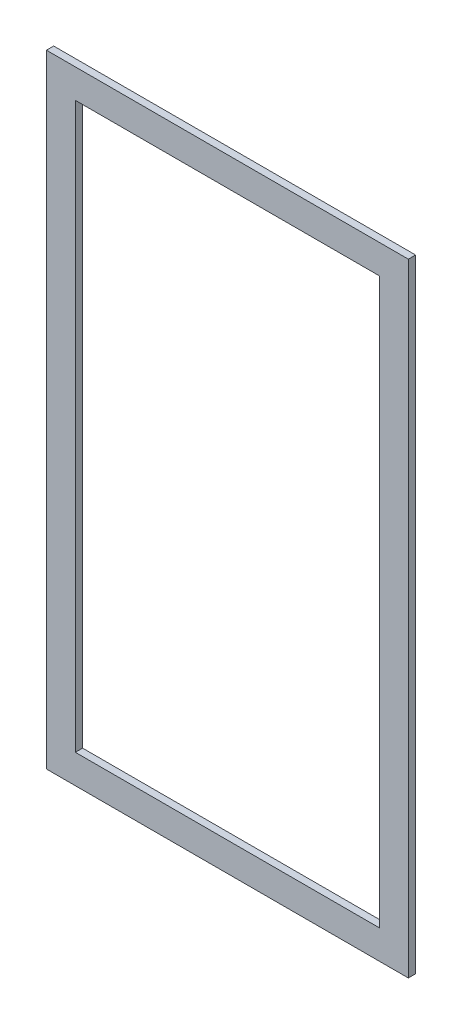
ISO-10303-21;
HEADER;
FILE_DESCRIPTION(('STEP AP214'),'2;1');
FILE_NAME('part.step','',(''),(''),'','','');
FILE_SCHEMA(('AUTOMOTIVE_DESIGN { 1 0 10303 214 1 1 1 1 }'));
ENDSEC;
DATA;
#1=APPLICATION_CONTEXT('core data for automotive mechanical design processes');
#2=APPLICATION_PROTOCOL_DEFINITION('international standard','automotive_design',2000,#1);
#3=PRODUCT_CONTEXT('',#1,'mechanical');
#4=PRODUCT('Part','Part','',(#3));
#5=PRODUCT_RELATED_PRODUCT_CATEGORY('part','',(#4));
#6=PRODUCT_DEFINITION_FORMATION('','',#4);
#7=PRODUCT_DEFINITION_CONTEXT('part definition',#1,'design');
#8=PRODUCT_DEFINITION('design','',#6,#7);
#9=PRODUCT_DEFINITION_SHAPE('','',#8);
#10=(LENGTH_UNIT() NAMED_UNIT(*) SI_UNIT(.MILLI.,.METRE.));
#11=(NAMED_UNIT(*) PLANE_ANGLE_UNIT() SI_UNIT($,.RADIAN.));
#12=(NAMED_UNIT(*) SI_UNIT($,.STERADIAN.) SOLID_ANGLE_UNIT());
#13=UNCERTAINTY_MEASURE_WITH_UNIT(LENGTH_MEASURE(1.E-05),#10,'distance_accuracy_value','');
#14=(GEOMETRIC_REPRESENTATION_CONTEXT(3) GLOBAL_UNCERTAINTY_ASSIGNED_CONTEXT((#13)) GLOBAL_UNIT_ASSIGNED_CONTEXT((#10,
#11,#12)) REPRESENTATION_CONTEXT('',''));
#15=CARTESIAN_POINT('',(0.,0.,0.));
#16=DIRECTION('',(0.,0.,1.));
#17=DIRECTION('',(1.,0.,0.));
#18=AXIS2_PLACEMENT_3D('',#15,#16,#17);
#19=CARTESIAN_POINT('',(0.,0.,-2.5));
#20=DIRECTION('',(0.,0.,1.));
#21=DIRECTION('',(1.,0.,0.));
#22=AXIS2_PLACEMENT_3D('',#19,#20,#21);
#23=PLANE('',#22);
#24=DIRECTION('',(1.,0.,0.));
#25=VECTOR('',#24,1.);
#26=CARTESIAN_POINT('',(0.,195.,-2.5));
#27=LINE('',#26,#25);
#28=CARTESIAN_POINT('',(105.,195.,-2.5));
#29=VERTEX_POINT('',#28);
#30=CARTESIAN_POINT('',(-105.,195.,-2.5));
#31=VERTEX_POINT('',#30);
#32=EDGE_CURVE('E121',#29,#31,#27,.F.);
#33=ORIENTED_EDGE('',*,*,#32,.T.);
#34=DIRECTION('',(0.,1.,0.));
#35=VECTOR('',#34,1.);
#36=CARTESIAN_POINT('',(-105.,0.,-2.5));
#37=LINE('',#36,#35);
#38=CARTESIAN_POINT('',(-105.,-195.,-2.5));
#39=VERTEX_POINT('',#38);
#40=EDGE_CURVE('E117',#39,#31,#37,.T.);
#41=ORIENTED_EDGE('',*,*,#40,.F.);
#42=DIRECTION('',(1.,0.,0.));
#43=VECTOR('',#42,1.);
#44=CARTESIAN_POINT('',(0.,-195.,-2.5));
#45=LINE('',#44,#43);
#46=CARTESIAN_POINT('',(105.,-195.,-2.5));
#47=VERTEX_POINT('',#46);
#48=EDGE_CURVE('E135',#47,#39,#45,.F.);
#49=ORIENTED_EDGE('',*,*,#48,.F.);
#50=DIRECTION('',(0.,1.,0.));
#51=VECTOR('',#50,1.);
#52=CARTESIAN_POINT('',(105.,0.,-2.5));
#53=LINE('',#52,#51);
#54=EDGE_CURVE('E127',#47,#29,#53,.T.);
#55=ORIENTED_EDGE('',*,*,#54,.T.);
#56=EDGE_LOOP('',(#33,#41,#49,#55));
#57=FACE_BOUND('',#56,.T.);
#58=DIRECTION('',(0.,1.,0.));
#59=VECTOR('',#58,1.);
#60=CARTESIAN_POINT('',(125.,215.,-2.5));
#61=LINE('',#60,#59);
#62=CARTESIAN_POINT('',(125.,-215.,-2.5));
#63=VERTEX_POINT('',#62);
#64=CARTESIAN_POINT('',(125.,215.,-2.5));
#65=VERTEX_POINT('',#64);
#66=EDGE_CURVE('E19',#63,#65,#61,.T.);
#67=ORIENTED_EDGE('',*,*,#66,.F.);
#68=DIRECTION('',(1.,0.,0.));
#69=VECTOR('',#68,1.);
#70=CARTESIAN_POINT('',(-125.,-215.,-2.5));
#71=LINE('',#70,#69);
#72=CARTESIAN_POINT('',(-125.,-215.,-2.5));
#73=VERTEX_POINT('',#72);
#74=EDGE_CURVE('E109',#63,#73,#71,.F.);
#75=ORIENTED_EDGE('',*,*,#74,.T.);
#76=DIRECTION('',(0.,1.,0.));
#77=VECTOR('',#76,1.);
#78=CARTESIAN_POINT('',(-125.,215.,-2.5));
#79=LINE('',#78,#77);
#80=CARTESIAN_POINT('',(-125.,215.,-2.5));
#81=VERTEX_POINT('',#80);
#82=EDGE_CURVE('E79',#73,#81,#79,.T.);
#83=ORIENTED_EDGE('',*,*,#82,.T.);
#84=DIRECTION('',(1.,0.,0.));
#85=VECTOR('',#84,1.);
#86=CARTESIAN_POINT('',(-125.,215.,-2.5));
#87=LINE('',#86,#85);
#88=EDGE_CURVE('E92',#65,#81,#87,.F.);
#89=ORIENTED_EDGE('',*,*,#88,.F.);
#90=EDGE_LOOP('',(#67,#75,#83,#89));
#91=FACE_BOUND('',#90,.T.);
#92=ADVANCED_FACE('F16',(#57,#91),#23,.F.);
#93=CARTESIAN_POINT('',(125.,215.,2.5));
#94=DIRECTION('',(1.,0.,0.));
#95=DIRECTION('',(0.,1.,0.));
#96=AXIS2_PLACEMENT_3D('',#93,#94,#95);
#97=PLANE('',#96);
#98=ORIENTED_EDGE('',*,*,#66,.T.);
#99=DIRECTION('',(0.,0.,1.));
#100=VECTOR('',#99,1.);
#101=CARTESIAN_POINT('',(125.,215.,2.5));
#102=LINE('',#101,#100);
#103=CARTESIAN_POINT('',(125.,215.,2.5));
#104=VERTEX_POINT('',#103);
#105=EDGE_CURVE('E86',#104,#65,#102,.F.);
#106=ORIENTED_EDGE('',*,*,#105,.F.);
#107=DIRECTION('',(0.,1.,0.));
#108=VECTOR('',#107,1.);
#109=CARTESIAN_POINT('',(125.,0.,2.5));
#110=LINE('',#109,#108);
#111=CARTESIAN_POINT('',(125.,-215.,2.5));
#112=VERTEX_POINT('',#111);
#113=EDGE_CURVE('E143',#112,#104,#110,.T.);
#114=ORIENTED_EDGE('',*,*,#113,.F.);
#115=DIRECTION('',(0.,0.,1.));
#116=VECTOR('',#115,1.);
#117=CARTESIAN_POINT('',(125.,-215.,2.5));
#118=LINE('',#117,#116);
#119=EDGE_CURVE('E89',#112,#63,#118,.F.);
#120=ORIENTED_EDGE('',*,*,#119,.T.);
#121=EDGE_LOOP('',(#98,#106,#114,#120));
#122=FACE_BOUND('',#121,.T.);
#123=ADVANCED_FACE('F84',(#122),#97,.T.);
#124=CARTESIAN_POINT('',(-125.,215.,2.5));
#125=DIRECTION('',(0.,1.,0.));
#126=DIRECTION('',(0.,0.,1.));
#127=AXIS2_PLACEMENT_3D('',#124,#125,#126);
#128=PLANE('',#127);
#129=ORIENTED_EDGE('',*,*,#88,.T.);
#130=DIRECTION('',(0.,0.,1.));
#131=VECTOR('',#130,1.);
#132=CARTESIAN_POINT('',(-125.,215.,2.5));
#133=LINE('',#132,#131);
#134=CARTESIAN_POINT('',(-125.,215.,2.5));
#135=VERTEX_POINT('',#134);
#136=EDGE_CURVE('E106',#81,#135,#133,.T.);
#137=ORIENTED_EDGE('',*,*,#136,.T.);
#138=DIRECTION('',(1.,0.,0.));
#139=VECTOR('',#138,1.);
#140=CARTESIAN_POINT('',(0.,215.,2.5));
#141=LINE('',#140,#139);
#142=EDGE_CURVE('E99',#104,#135,#141,.F.);
#143=ORIENTED_EDGE('',*,*,#142,.F.);
#144=ORIENTED_EDGE('',*,*,#105,.T.);
#145=EDGE_LOOP('',(#129,#137,#143,#144));
#146=FACE_BOUND('',#145,.T.);
#147=ADVANCED_FACE('F97',(#146),#128,.T.);
#148=CARTESIAN_POINT('',(-125.,215.,2.5));
#149=DIRECTION('',(1.,0.,0.));
#150=DIRECTION('',(0.,1.,0.));
#151=AXIS2_PLACEMENT_3D('',#148,#149,#150);
#152=PLANE('',#151);
#153=DIRECTION('',(0.,1.,0.));
#154=VECTOR('',#153,1.);
#155=CARTESIAN_POINT('',(-125.,0.,2.5));
#156=LINE('',#155,#154);
#157=CARTESIAN_POINT('',(-125.,-215.,2.5));
#158=VERTEX_POINT('',#157);
#159=EDGE_CURVE('E148',#135,#158,#156,.F.);
#160=ORIENTED_EDGE('',*,*,#159,.F.);
#161=ORIENTED_EDGE('',*,*,#136,.F.);
#162=ORIENTED_EDGE('',*,*,#82,.F.);
#163=DIRECTION('',(0.,0.,1.));
#164=VECTOR('',#163,1.);
#165=CARTESIAN_POINT('',(-125.,-215.,2.5));
#166=LINE('',#165,#164);
#167=EDGE_CURVE('E112',#73,#158,#166,.T.);
#168=ORIENTED_EDGE('',*,*,#167,.T.);
#169=EDGE_LOOP('',(#160,#161,#162,#168));
#170=FACE_BOUND('',#169,.T.);
#171=ADVANCED_FACE('F200',(#170),#152,.F.);
#172=CARTESIAN_POINT('',(-125.,-215.,2.5));
#173=DIRECTION('',(0.,1.,0.));
#174=DIRECTION('',(0.,0.,1.));
#175=AXIS2_PLACEMENT_3D('',#172,#173,#174);
#176=PLANE('',#175);
#177=DIRECTION('',(1.,0.,0.));
#178=VECTOR('',#177,1.);
#179=CARTESIAN_POINT('',(0.,-215.,2.5));
#180=LINE('',#179,#178);
#181=EDGE_CURVE('E152',#158,#112,#180,.T.);
#182=ORIENTED_EDGE('',*,*,#181,.F.);
#183=ORIENTED_EDGE('',*,*,#167,.F.);
#184=ORIENTED_EDGE('',*,*,#74,.F.);
#185=ORIENTED_EDGE('',*,*,#119,.F.);
#186=EDGE_LOOP('',(#182,#183,#184,#185));
#187=FACE_BOUND('',#186,.T.);
#188=ADVANCED_FACE('F197',(#187),#176,.F.);
#189=CARTESIAN_POINT('',(-105.,0.,2.5));
#190=DIRECTION('',(1.,0.,0.));
#191=DIRECTION('',(0.,0.,-1.));
#192=AXIS2_PLACEMENT_3D('',#189,#190,#191);
#193=PLANE('',#192);
#194=ORIENTED_EDGE('',*,*,#40,.T.);
#195=DIRECTION('',(0.,0.,1.));
#196=VECTOR('',#195,1.);
#197=CARTESIAN_POINT('',(-105.,195.,2.5));
#198=LINE('',#197,#196);
#199=CARTESIAN_POINT('',(-105.,195.,2.5));
#200=VERTEX_POINT('',#199);
#201=EDGE_CURVE('E124',#31,#200,#198,.T.);
#202=ORIENTED_EDGE('',*,*,#201,.T.);
#203=DIRECTION('',(0.,1.,0.));
#204=VECTOR('',#203,1.);
#205=CARTESIAN_POINT('',(-105.,0.,2.5));
#206=LINE('',#205,#204);
#207=CARTESIAN_POINT('',(-105.,-195.,2.5));
#208=VERTEX_POINT('',#207);
#209=EDGE_CURVE('E156',#208,#200,#206,.T.);
#210=ORIENTED_EDGE('',*,*,#209,.F.);
#211=DIRECTION('',(0.,0.,1.));
#212=VECTOR('',#211,1.);
#213=CARTESIAN_POINT('',(-105.,-195.,2.5));
#214=LINE('',#213,#212);
#215=EDGE_CURVE('E139',#39,#208,#214,.T.);
#216=ORIENTED_EDGE('',*,*,#215,.F.);
#217=EDGE_LOOP('',(#194,#202,#210,#216));
#218=FACE_BOUND('',#217,.T.);
#219=ADVANCED_FACE('F180',(#218),#193,.T.);
#220=CARTESIAN_POINT('',(0.,195.,2.5));
#221=DIRECTION('',(0.,1.,0.));
#222=DIRECTION('',(0.,0.,1.));
#223=AXIS2_PLACEMENT_3D('',#220,#221,#222);
#224=PLANE('',#223);
#225=DIRECTION('',(1.,0.,0.));
#226=VECTOR('',#225,1.);
#227=CARTESIAN_POINT('',(0.,195.,2.5));
#228=LINE('',#227,#226);
#229=CARTESIAN_POINT('',(105.,195.,2.5));
#230=VERTEX_POINT('',#229);
#231=EDGE_CURVE('E160',#200,#230,#228,.T.);
#232=ORIENTED_EDGE('',*,*,#231,.F.);
#233=ORIENTED_EDGE('',*,*,#201,.F.);
#234=ORIENTED_EDGE('',*,*,#32,.F.);
#235=DIRECTION('',(0.,0.,-1.));
#236=VECTOR('',#235,1.);
#237=CARTESIAN_POINT('',(105.,195.,2.5));
#238=LINE('',#237,#236);
#239=EDGE_CURVE('E130',#29,#230,#238,.F.);
#240=ORIENTED_EDGE('',*,*,#239,.T.);
#241=EDGE_LOOP('',(#232,#233,#234,#240));
#242=FACE_BOUND('',#241,.T.);
#243=ADVANCED_FACE('F175',(#242),#224,.F.);
#244=CARTESIAN_POINT('',(105.,0.,2.5));
#245=DIRECTION('',(1.,0.,0.));
#246=DIRECTION('',(0.,0.,-1.));
#247=AXIS2_PLACEMENT_3D('',#244,#245,#246);
#248=PLANE('',#247);
#249=DIRECTION('',(0.,1.,0.));
#250=VECTOR('',#249,1.);
#251=CARTESIAN_POINT('',(105.,0.,2.5));
#252=LINE('',#251,#250);
#253=CARTESIAN_POINT('',(105.,-195.,2.5));
#254=VERTEX_POINT('',#253);
#255=EDGE_CURVE('E26',#230,#254,#252,.F.);
#256=ORIENTED_EDGE('',*,*,#255,.F.);
#257=ORIENTED_EDGE('',*,*,#239,.F.);
#258=ORIENTED_EDGE('',*,*,#54,.F.);
#259=DIRECTION('',(0.,0.,1.));
#260=VECTOR('',#259,1.);
#261=CARTESIAN_POINT('',(105.,-195.,2.5));
#262=LINE('',#261,#260);
#263=EDGE_CURVE('E35',#254,#47,#262,.F.);
#264=ORIENTED_EDGE('',*,*,#263,.F.);
#265=EDGE_LOOP('',(#256,#257,#258,#264));
#266=FACE_BOUND('',#265,.T.);
#267=ADVANCED_FACE('F171',(#266),#248,.F.);
#268=CARTESIAN_POINT('',(0.,-195.,2.5));
#269=DIRECTION('',(0.,1.,0.));
#270=DIRECTION('',(0.,0.,1.));
#271=AXIS2_PLACEMENT_3D('',#268,#269,#270);
#272=PLANE('',#271);
#273=ORIENTED_EDGE('',*,*,#48,.T.);
#274=ORIENTED_EDGE('',*,*,#215,.T.);
#275=DIRECTION('',(1.,0.,0.));
#276=VECTOR('',#275,1.);
#277=CARTESIAN_POINT('',(0.,-195.,2.5));
#278=LINE('',#277,#276);
#279=EDGE_CURVE('E11',#254,#208,#278,.F.);
#280=ORIENTED_EDGE('',*,*,#279,.F.);
#281=ORIENTED_EDGE('',*,*,#263,.T.);
#282=EDGE_LOOP('',(#273,#274,#280,#281));
#283=FACE_BOUND('',#282,.T.);
#284=ADVANCED_FACE('F182',(#283),#272,.T.);
#285=CARTESIAN_POINT('',(0.,0.,2.5));
#286=DIRECTION('',(0.,0.,1.));
#287=DIRECTION('',(1.,0.,0.));
#288=AXIS2_PLACEMENT_3D('',#285,#286,#287);
#289=PLANE('',#288);
#290=ORIENTED_EDGE('',*,*,#255,.T.);
#291=ORIENTED_EDGE('',*,*,#279,.T.);
#292=ORIENTED_EDGE('',*,*,#209,.T.);
#293=ORIENTED_EDGE('',*,*,#231,.T.);
#294=EDGE_LOOP('',(#290,#291,#292,#293));
#295=FACE_BOUND('',#294,.T.);
#296=ORIENTED_EDGE('',*,*,#159,.T.);
#297=ORIENTED_EDGE('',*,*,#181,.T.);
#298=ORIENTED_EDGE('',*,*,#113,.T.);
#299=ORIENTED_EDGE('',*,*,#142,.T.);
#300=EDGE_LOOP('',(#296,#297,#298,#299));
#301=FACE_BOUND('',#300,.T.);
#302=ADVANCED_FACE('F167',(#295,#301),#289,.T.);
#303=CLOSED_SHELL('',(#92,#123,#147,#171,#188,#219,#243,#267,#284,#302));
#304=MANIFOLD_SOLID_BREP('B1',#303);
#305=ADVANCED_BREP_SHAPE_REPRESENTATION('',(#18,#304),#14);
#306=SHAPE_DEFINITION_REPRESENTATION(#9,#305);
ENDSEC;
END-ISO-10303-21;
